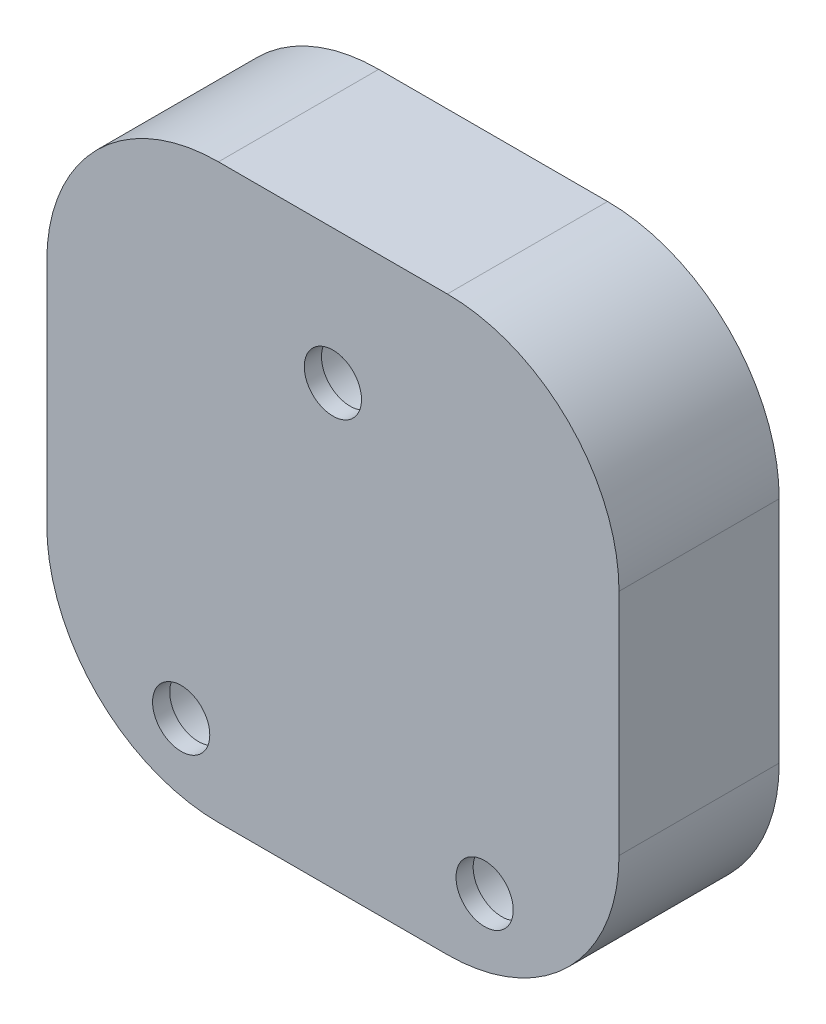
ISO-10303-21;
HEADER;
FILE_DESCRIPTION(('STEP AP214'),'2;1');
FILE_NAME('part.step','',(''),(''),'','','');
FILE_SCHEMA(('AUTOMOTIVE_DESIGN { 1 0 10303 214 1 1 1 1 }'));
ENDSEC;
DATA;
#1=APPLICATION_CONTEXT('core data for automotive mechanical design processes');
#2=APPLICATION_PROTOCOL_DEFINITION('international standard','automotive_design',2000,#1);
#3=PRODUCT_CONTEXT('',#1,'mechanical');
#4=PRODUCT('Part','Part','',(#3));
#5=PRODUCT_RELATED_PRODUCT_CATEGORY('part','',(#4));
#6=PRODUCT_DEFINITION_FORMATION('','',#4);
#7=PRODUCT_DEFINITION_CONTEXT('part definition',#1,'design');
#8=PRODUCT_DEFINITION('design','',#6,#7);
#9=PRODUCT_DEFINITION_SHAPE('','',#8);
#10=(LENGTH_UNIT() NAMED_UNIT(*) SI_UNIT(.MILLI.,.METRE.));
#11=(NAMED_UNIT(*) PLANE_ANGLE_UNIT() SI_UNIT($,.RADIAN.));
#12=(NAMED_UNIT(*) SI_UNIT($,.STERADIAN.) SOLID_ANGLE_UNIT());
#13=UNCERTAINTY_MEASURE_WITH_UNIT(LENGTH_MEASURE(1.E-05),#10,'distance_accuracy_value','');
#14=(GEOMETRIC_REPRESENTATION_CONTEXT(3) GLOBAL_UNCERTAINTY_ASSIGNED_CONTEXT((#13)) GLOBAL_UNIT_ASSIGNED_CONTEXT((#10,
#11,#12)) REPRESENTATION_CONTEXT('',''));
#15=CARTESIAN_POINT('',(0.,0.,0.));
#16=DIRECTION('',(0.,0.,1.));
#17=DIRECTION('',(1.,0.,0.));
#18=AXIS2_PLACEMENT_3D('',#15,#16,#17);
#19=CARTESIAN_POINT('',(-50.,87.5,-25.));
#20=DIRECTION('',(-1.,0.,0.));
#21=DIRECTION('',(0.,0.,1.));
#22=AXIS2_PLACEMENT_3D('',#19,#20,#21);
#23=PLANE('',#22);
#24=DIRECTION('',(0.,-1.,0.));
#25=VECTOR('',#24,1.);
#26=CARTESIAN_POINT('',(-50.,87.5,3.));
#27=LINE('',#26,#25);
#28=CARTESIAN_POINT('',(-50.,57.5,3.));
#29=VERTEX_POINT('',#28);
#30=CARTESIAN_POINT('',(-50.,17.5,3.));
#31=VERTEX_POINT('',#30);
#32=EDGE_CURVE('E262',#29,#31,#27,.T.);
#33=ORIENTED_EDGE('',*,*,#32,.F.);
#34=DIRECTION('',(0.,0.,1.));
#35=VECTOR('',#34,1.);
#36=CARTESIAN_POINT('',(-50.,57.5,-25.));
#37=LINE('',#36,#35);
#38=CARTESIAN_POINT('',(-50.,57.5,-25.));
#39=VERTEX_POINT('',#38);
#40=EDGE_CURVE('E152',#29,#39,#37,.F.);
#41=ORIENTED_EDGE('',*,*,#40,.T.);
#42=DIRECTION('',(0.,-1.,0.));
#43=VECTOR('',#42,1.);
#44=CARTESIAN_POINT('',(-50.,87.5,-25.));
#45=LINE('',#44,#43);
#46=CARTESIAN_POINT('',(-50.,17.5,-25.));
#47=VERTEX_POINT('',#46);
#48=EDGE_CURVE('E291',#39,#47,#45,.T.);
#49=ORIENTED_EDGE('',*,*,#48,.T.);
#50=DIRECTION('',(0.,0.,1.));
#51=VECTOR('',#50,1.);
#52=CARTESIAN_POINT('',(-50.,17.5,-25.));
#53=LINE('',#52,#51);
#54=EDGE_CURVE('E149',#47,#31,#53,.T.);
#55=ORIENTED_EDGE('',*,*,#54,.T.);
#56=EDGE_LOOP('',(#33,#41,#49,#55));
#57=FACE_BOUND('',#56,.T.);
#58=ADVANCED_FACE('F35',(#57),#23,.T.);
#59=CARTESIAN_POINT('',(-50.,87.5,-25.));
#60=DIRECTION('',(0.,1.,0.));
#61=DIRECTION('',(0.,0.,1.));
#62=AXIS2_PLACEMENT_3D('',#59,#60,#61);
#63=PLANE('',#62);
#64=DIRECTION('',(-1.,0.,0.));
#65=VECTOR('',#64,1.);
#66=CARTESIAN_POINT('',(50.,87.5,3.));
#67=LINE('',#66,#65);
#68=CARTESIAN_POINT('',(20.,87.5,3.));
#69=VERTEX_POINT('',#68);
#70=CARTESIAN_POINT('',(-20.,87.5,3.));
#71=VERTEX_POINT('',#70);
#72=EDGE_CURVE('E261',#69,#71,#67,.T.);
#73=ORIENTED_EDGE('',*,*,#72,.F.);
#74=DIRECTION('',(0.,0.,1.));
#75=VECTOR('',#74,1.);
#76=CARTESIAN_POINT('',(20.,87.5,-25.));
#77=LINE('',#76,#75);
#78=CARTESIAN_POINT('',(20.,87.5,-25.));
#79=VERTEX_POINT('',#78);
#80=EDGE_CURVE('E140',#69,#79,#77,.F.);
#81=ORIENTED_EDGE('',*,*,#80,.T.);
#82=DIRECTION('',(-1.,0.,0.));
#83=VECTOR('',#82,1.);
#84=CARTESIAN_POINT('',(-50.,87.5,-25.));
#85=LINE('',#84,#83);
#86=CARTESIAN_POINT('',(-20.,87.5,-25.));
#87=VERTEX_POINT('',#86);
#88=EDGE_CURVE('E125',#79,#87,#85,.T.);
#89=ORIENTED_EDGE('',*,*,#88,.T.);
#90=DIRECTION('',(0.,0.,1.));
#91=VECTOR('',#90,1.);
#92=CARTESIAN_POINT('',(-20.,87.5,-25.));
#93=LINE('',#92,#91);
#94=EDGE_CURVE('E137',#87,#71,#93,.T.);
#95=ORIENTED_EDGE('',*,*,#94,.T.);
#96=EDGE_LOOP('',(#73,#81,#89,#95));
#97=FACE_BOUND('',#96,.T.);
#98=ADVANCED_FACE('F189',(#97),#63,.T.);
#99=CARTESIAN_POINT('',(50.,87.5,-25.));
#100=DIRECTION('',(1.,0.,0.));
#101=DIRECTION('',(0.,1.,0.));
#102=AXIS2_PLACEMENT_3D('',#99,#100,#101);
#103=PLANE('',#102);
#104=DIRECTION('',(0.,1.,0.));
#105=VECTOR('',#104,1.);
#106=CARTESIAN_POINT('',(50.,87.5,-25.));
#107=LINE('',#106,#105);
#108=CARTESIAN_POINT('',(50.,17.5,-25.));
#109=VERTEX_POINT('',#108);
#110=CARTESIAN_POINT('',(50.,57.5,-25.));
#111=VERTEX_POINT('',#110);
#112=EDGE_CURVE('E129',#109,#111,#107,.T.);
#113=ORIENTED_EDGE('',*,*,#112,.T.);
#114=DIRECTION('',(0.,0.,1.));
#115=VECTOR('',#114,1.);
#116=CARTESIAN_POINT('',(50.,57.5,-25.));
#117=LINE('',#116,#115);
#118=CARTESIAN_POINT('',(50.,57.5,3.));
#119=VERTEX_POINT('',#118);
#120=EDGE_CURVE('E121',#111,#119,#117,.T.);
#121=ORIENTED_EDGE('',*,*,#120,.T.);
#122=DIRECTION('',(0.,1.,0.));
#123=VECTOR('',#122,1.);
#124=CARTESIAN_POINT('',(50.,-12.5,3.));
#125=LINE('',#124,#123);
#126=CARTESIAN_POINT('',(50.,17.5,3.));
#127=VERTEX_POINT('',#126);
#128=EDGE_CURVE('E106',#127,#119,#125,.T.);
#129=ORIENTED_EDGE('',*,*,#128,.F.);
#130=DIRECTION('',(0.,0.,1.));
#131=VECTOR('',#130,1.);
#132=CARTESIAN_POINT('',(50.,17.5,-25.));
#133=LINE('',#132,#131);
#134=EDGE_CURVE('E119',#127,#109,#133,.F.);
#135=ORIENTED_EDGE('',*,*,#134,.T.);
#136=EDGE_LOOP('',(#113,#121,#129,#135));
#137=FACE_BOUND('',#136,.T.);
#138=ADVANCED_FACE('F118',(#137),#103,.T.);
#139=CARTESIAN_POINT('',(-50.,-12.5,-25.));
#140=DIRECTION('',(0.,-1.,0.));
#141=DIRECTION('',(1.,0.,0.));
#142=AXIS2_PLACEMENT_3D('',#139,#140,#141);
#143=PLANE('',#142);
#144=DIRECTION('',(1.,0.,0.));
#145=VECTOR('',#144,1.);
#146=CARTESIAN_POINT('',(-50.,-12.5,-25.));
#147=LINE('',#146,#145);
#148=CARTESIAN_POINT('',(-20.,-12.5,-25.));
#149=VERTEX_POINT('',#148);
#150=CARTESIAN_POINT('',(20.,-12.5,-25.));
#151=VERTEX_POINT('',#150);
#152=EDGE_CURVE('E296',#149,#151,#147,.T.);
#153=ORIENTED_EDGE('',*,*,#152,.T.);
#154=DIRECTION('',(0.,0.,1.));
#155=VECTOR('',#154,1.);
#156=CARTESIAN_POINT('',(20.,-12.5,-25.));
#157=LINE('',#156,#155);
#158=CARTESIAN_POINT('',(20.,-12.5,3.));
#159=VERTEX_POINT('',#158);
#160=EDGE_CURVE('E155',#151,#159,#157,.T.);
#161=ORIENTED_EDGE('',*,*,#160,.T.);
#162=DIRECTION('',(1.,0.,0.));
#163=VECTOR('',#162,1.);
#164=CARTESIAN_POINT('',(-50.,-12.5,3.));
#165=LINE('',#164,#163);
#166=CARTESIAN_POINT('',(-20.,-12.5,3.));
#167=VERTEX_POINT('',#166);
#168=EDGE_CURVE('E107',#167,#159,#165,.T.);
#169=ORIENTED_EDGE('',*,*,#168,.F.);
#170=DIRECTION('',(0.,0.,1.));
#171=VECTOR('',#170,1.);
#172=CARTESIAN_POINT('',(-20.,-12.5,-25.));
#173=LINE('',#172,#171);
#174=EDGE_CURVE('E57',#167,#149,#173,.F.);
#175=ORIENTED_EDGE('',*,*,#174,.T.);
#176=EDGE_LOOP('',(#153,#161,#169,#175));
#177=FACE_BOUND('',#176,.T.);
#178=ADVANCED_FACE('F200',(#177),#143,.T.);
#179=CARTESIAN_POINT('',(0.,0.,-25.));
#180=DIRECTION('',(0.,0.,1.));
#181=DIRECTION('',(1.,0.,0.));
#182=AXIS2_PLACEMENT_3D('',#179,#180,#181);
#183=PLANE('',#182);
#184=CARTESIAN_POINT('',(0.,37.5,-25.));
#185=DIRECTION('',(0.,0.,1.));
#186=DIRECTION('',(1.,0.,0.));
#187=AXIS2_PLACEMENT_3D('',#184,#185,#186);
#188=CIRCLE('',#187,10.5);
#189=CARTESIAN_POINT('',(10.5,37.5,-25.));
#190=VERTEX_POINT('',#189);
#191=EDGE_CURVE('E12',#190,#190,#188,.T.);
#192=ORIENTED_EDGE('',*,*,#191,.T.);
#193=EDGE_LOOP('',(#192));
#194=FACE_BOUND('',#193,.T.);
#195=CARTESIAN_POINT('',(26.5165042944955,0.,-25.));
#196=DIRECTION('',(0.,0.,1.));
#197=DIRECTION('',(1.,0.,0.));
#198=AXIS2_PLACEMENT_3D('',#195,#196,#197);
#199=CIRCLE('',#198,11.0999999996577);
#200=CARTESIAN_POINT('',(37.6165042941533,0.,-25.));
#201=VERTEX_POINT('',#200);
#202=EDGE_CURVE('E163',#201,#201,#199,.T.);
#203=ORIENTED_EDGE('',*,*,#202,.T.);
#204=EDGE_LOOP('',(#203));
#205=FACE_BOUND('',#204,.T.);
#206=CARTESIAN_POINT('',(-26.5165042944955,0.,-25.));
#207=DIRECTION('',(0.,0.,1.));
#208=DIRECTION('',(1.,0.,0.));
#209=AXIS2_PLACEMENT_3D('',#206,#207,#208);
#210=CIRCLE('',#209,11.0999999996578);
#211=CARTESIAN_POINT('',(-15.4165042948378,0.,-25.));
#212=VERTEX_POINT('',#211);
#213=EDGE_CURVE('E160',#212,#212,#210,.T.);
#214=ORIENTED_EDGE('',*,*,#213,.T.);
#215=EDGE_LOOP('',(#214));
#216=FACE_BOUND('',#215,.T.);
#217=CARTESIAN_POINT('',(0.,64.0165042944955,-25.));
#218=DIRECTION('',(0.,0.,1.));
#219=DIRECTION('',(1.,0.,0.));
#220=AXIS2_PLACEMENT_3D('',#217,#218,#219);
#221=CIRCLE('',#220,11.0999999996577);
#222=CARTESIAN_POINT('',(11.0999999996578,64.0165042944955,-25.));
#223=VERTEX_POINT('',#222);
#224=EDGE_CURVE('E157',#223,#223,#221,.T.);
#225=ORIENTED_EDGE('',*,*,#224,.T.);
#226=EDGE_LOOP('',(#225));
#227=FACE_BOUND('',#226,.T.);
#228=CARTESIAN_POINT('',(-26.5165042944955,64.0165042944955,-25.));
#229=DIRECTION('',(0.,0.,1.));
#230=DIRECTION('',(1.,0.,0.));
#231=AXIS2_PLACEMENT_3D('',#228,#229,#230);
#232=CIRCLE('',#231,4.025);
#233=CARTESIAN_POINT('',(-22.4915042944955,64.0165042944955,-25.));
#234=VERTEX_POINT('',#233);
#235=EDGE_CURVE('E245',#234,#234,#232,.T.);
#236=ORIENTED_EDGE('',*,*,#235,.T.);
#237=EDGE_LOOP('',(#236));
#238=FACE_BOUND('',#237,.T.);
#239=CARTESIAN_POINT('',(26.5165042944955,64.0165042944955,-25.));
#240=DIRECTION('',(0.,0.,1.));
#241=DIRECTION('',(1.,0.,0.));
#242=AXIS2_PLACEMENT_3D('',#239,#240,#241);
#243=CIRCLE('',#242,4.025);
#244=CARTESIAN_POINT('',(30.5415042944955,64.0165042944955,-25.));
#245=VERTEX_POINT('',#244);
#246=EDGE_CURVE('E249',#245,#245,#243,.T.);
#247=ORIENTED_EDGE('',*,*,#246,.T.);
#248=EDGE_LOOP('',(#247));
#249=FACE_BOUND('',#248,.T.);
#250=CARTESIAN_POINT('',(0.,0.,-25.));
#251=DIRECTION('',(0.,0.,1.));
#252=DIRECTION('',(1.,0.,0.));
#253=AXIS2_PLACEMENT_3D('',#250,#251,#252);
#254=CIRCLE('',#253,4.025);
#255=CARTESIAN_POINT('',(4.025,0.,-25.));
#256=VERTEX_POINT('',#255);
#257=EDGE_CURVE('E252',#256,#256,#254,.T.);
#258=ORIENTED_EDGE('',*,*,#257,.T.);
#259=EDGE_LOOP('',(#258));
#260=FACE_BOUND('',#259,.T.);
#261=ORIENTED_EDGE('',*,*,#88,.F.);
#262=CARTESIAN_POINT('',(20.,57.5,-25.));
#263=DIRECTION('',(0.,0.,1.));
#264=DIRECTION('',(1.,0.,0.));
#265=AXIS2_PLACEMENT_3D('',#262,#263,#264);
#266=CIRCLE('',#265,30.);
#267=EDGE_CURVE('E147',#79,#111,#266,.F.);
#268=ORIENTED_EDGE('',*,*,#267,.T.);
#269=ORIENTED_EDGE('',*,*,#112,.F.);
#270=CARTESIAN_POINT('',(20.,17.5,-25.));
#271=DIRECTION('',(0.,0.,1.));
#272=DIRECTION('',(1.,0.,0.));
#273=AXIS2_PLACEMENT_3D('',#270,#271,#272);
#274=CIRCLE('',#273,30.);
#275=EDGE_CURVE('E50',#109,#151,#274,.F.);
#276=ORIENTED_EDGE('',*,*,#275,.T.);
#277=ORIENTED_EDGE('',*,*,#152,.F.);
#278=CARTESIAN_POINT('',(-20.,17.5,-25.));
#279=DIRECTION('',(0.,0.,1.));
#280=DIRECTION('',(1.,0.,0.));
#281=AXIS2_PLACEMENT_3D('',#278,#279,#280);
#282=CIRCLE('',#281,30.);
#283=EDGE_CURVE('E142',#149,#47,#282,.F.);
#284=ORIENTED_EDGE('',*,*,#283,.T.);
#285=ORIENTED_EDGE('',*,*,#48,.F.);
#286=CARTESIAN_POINT('',(-20.,57.5,-25.));
#287=DIRECTION('',(0.,0.,1.));
#288=DIRECTION('',(1.,0.,0.));
#289=AXIS2_PLACEMENT_3D('',#286,#287,#288);
#290=CIRCLE('',#289,30.);
#291=EDGE_CURVE('E145',#39,#87,#290,.F.);
#292=ORIENTED_EDGE('',*,*,#291,.T.);
#293=EDGE_LOOP('',(#261,#268,#269,#276,#277,#284,#285,#292));
#294=FACE_BOUND('',#293,.T.);
#295=ADVANCED_FACE('F236',(#194,#205,#216,#227,#238,#249,#260,#294),#183,.F.);
#296=CARTESIAN_POINT('',(0.,0.,-25.));
#297=DIRECTION('',(0.,0.,1.));
#298=DIRECTION('',(1.,0.,0.));
#299=AXIS2_PLACEMENT_3D('',#296,#297,#298);
#300=CYLINDRICAL_SURFACE('',#299,4.025);
#301=ORIENTED_EDGE('',*,*,#257,.F.);
#302=EDGE_LOOP('',(#301));
#303=FACE_BOUND('',#302,.T.);
#304=CARTESIAN_POINT('',(0.,0.,0.));
#305=DIRECTION('',(0.,0.,1.));
#306=DIRECTION('',(1.,0.,0.));
#307=AXIS2_PLACEMENT_3D('',#304,#305,#306);
#308=CIRCLE('',#307,4.025);
#309=CARTESIAN_POINT('',(4.025,0.,0.));
#310=VERTEX_POINT('',#309);
#311=EDGE_CURVE('E122',#310,#310,#308,.T.);
#312=ORIENTED_EDGE('',*,*,#311,.T.);
#313=EDGE_LOOP('',(#312));
#314=FACE_BOUND('',#313,.T.);
#315=ADVANCED_FACE('F239',(#303,#314),#300,.F.);
#316=CARTESIAN_POINT('',(26.5165042944955,64.0165042944955,-25.));
#317=DIRECTION('',(0.,0.,1.));
#318=DIRECTION('',(1.,0.,0.));
#319=AXIS2_PLACEMENT_3D('',#316,#317,#318);
#320=CYLINDRICAL_SURFACE('',#319,4.025);
#321=ORIENTED_EDGE('',*,*,#246,.F.);
#322=EDGE_LOOP('',(#321));
#323=FACE_BOUND('',#322,.T.);
#324=CARTESIAN_POINT('',(26.5165042944955,64.0165042944955,0.));
#325=DIRECTION('',(0.,0.,1.));
#326=DIRECTION('',(1.,0.,0.));
#327=AXIS2_PLACEMENT_3D('',#324,#325,#326);
#328=CIRCLE('',#327,4.025);
#329=CARTESIAN_POINT('',(30.5415042944955,64.0165042944955,0.));
#330=VERTEX_POINT('',#329);
#331=EDGE_CURVE('E286',#330,#330,#328,.T.);
#332=ORIENTED_EDGE('',*,*,#331,.T.);
#333=EDGE_LOOP('',(#332));
#334=FACE_BOUND('',#333,.T.);
#335=ADVANCED_FACE('F309',(#323,#334),#320,.F.);
#336=CARTESIAN_POINT('',(-26.5165042944955,64.0165042944955,-25.));
#337=DIRECTION('',(0.,0.,1.));
#338=DIRECTION('',(1.,0.,0.));
#339=AXIS2_PLACEMENT_3D('',#336,#337,#338);
#340=CYLINDRICAL_SURFACE('',#339,4.025);
#341=ORIENTED_EDGE('',*,*,#235,.F.);
#342=EDGE_LOOP('',(#341));
#343=FACE_BOUND('',#342,.T.);
#344=CARTESIAN_POINT('',(-26.5165042944955,64.0165042944955,0.));
#345=DIRECTION('',(0.,0.,1.));
#346=DIRECTION('',(1.,0.,0.));
#347=AXIS2_PLACEMENT_3D('',#344,#345,#346);
#348=CIRCLE('',#347,4.025);
#349=CARTESIAN_POINT('',(-22.4915042944955,64.0165042944955,0.));
#350=VERTEX_POINT('',#349);
#351=EDGE_CURVE('E282',#350,#350,#348,.T.);
#352=ORIENTED_EDGE('',*,*,#351,.T.);
#353=EDGE_LOOP('',(#352));
#354=FACE_BOUND('',#353,.T.);
#355=ADVANCED_FACE('F313',(#343,#354),#340,.F.);
#356=CARTESIAN_POINT('',(0.,64.0165042944955,-25.));
#357=DIRECTION('',(0.,0.,1.));
#358=DIRECTION('',(1.,0.,0.));
#359=AXIS2_PLACEMENT_3D('',#356,#357,#358);
#360=CYLINDRICAL_SURFACE('',#359,8.09999999965775);
#361=CARTESIAN_POINT('',(0.,64.0165042944955,-22.));
#362=DIRECTION('',(0.,0.,1.));
#363=DIRECTION('',(1.,0.,0.));
#364=AXIS2_PLACEMENT_3D('',#361,#362,#363);
#365=CIRCLE('',#364,8.09999999965775);
#366=CARTESIAN_POINT('',(8.09999999965777,64.0165042944955,-22.));
#367=VERTEX_POINT('',#366);
#368=EDGE_CURVE('E172',#367,#367,#365,.F.);
#369=ORIENTED_EDGE('',*,*,#368,.T.);
#370=EDGE_LOOP('',(#369));
#371=FACE_BOUND('',#370,.T.);
#372=CARTESIAN_POINT('',(0.,64.0165042944955,0.));
#373=DIRECTION('',(0.,0.,1.));
#374=DIRECTION('',(1.,0.,0.));
#375=AXIS2_PLACEMENT_3D('',#372,#373,#374);
#376=CIRCLE('',#375,8.09999999965775);
#377=CARTESIAN_POINT('',(8.09999999965777,64.0165042944955,0.));
#378=VERTEX_POINT('',#377);
#379=EDGE_CURVE('E279',#378,#378,#376,.T.);
#380=ORIENTED_EDGE('',*,*,#379,.T.);
#381=EDGE_LOOP('',(#380));
#382=FACE_BOUND('',#381,.T.);
#383=ADVANCED_FACE('F317',(#371,#382),#360,.F.);
#384=CARTESIAN_POINT('',(-26.5165042944955,0.,-25.));
#385=DIRECTION('',(0.,0.,1.));
#386=DIRECTION('',(1.,0.,0.));
#387=AXIS2_PLACEMENT_3D('',#384,#385,#386);
#388=CYLINDRICAL_SURFACE('',#387,8.09999999965776);
#389=CARTESIAN_POINT('',(-26.5165042944955,0.,-22.));
#390=DIRECTION('',(0.,0.,1.));
#391=DIRECTION('',(1.,0.,0.));
#392=AXIS2_PLACEMENT_3D('',#389,#390,#391);
#393=CIRCLE('',#392,8.09999999965776);
#394=CARTESIAN_POINT('',(-18.4165042948378,0.,-22.));
#395=VERTEX_POINT('',#394);
#396=EDGE_CURVE('E169',#395,#395,#393,.F.);
#397=ORIENTED_EDGE('',*,*,#396,.T.);
#398=EDGE_LOOP('',(#397));
#399=FACE_BOUND('',#398,.T.);
#400=CARTESIAN_POINT('',(-26.5165042944955,0.,0.));
#401=DIRECTION('',(0.,0.,1.));
#402=DIRECTION('',(1.,0.,0.));
#403=AXIS2_PLACEMENT_3D('',#400,#401,#402);
#404=CIRCLE('',#403,8.09999999965776);
#405=CARTESIAN_POINT('',(-18.4165042948378,0.,0.));
#406=VERTEX_POINT('',#405);
#407=EDGE_CURVE('E276',#406,#406,#404,.T.);
#408=ORIENTED_EDGE('',*,*,#407,.T.);
#409=EDGE_LOOP('',(#408));
#410=FACE_BOUND('',#409,.T.);
#411=ADVANCED_FACE('F321',(#399,#410),#388,.F.);
#412=CARTESIAN_POINT('',(26.5165042944955,0.,-25.));
#413=DIRECTION('',(0.,0.,1.));
#414=DIRECTION('',(1.,0.,0.));
#415=AXIS2_PLACEMENT_3D('',#412,#413,#414);
#416=CYLINDRICAL_SURFACE('',#415,8.09999999965775);
#417=CARTESIAN_POINT('',(26.5165042944955,0.,-22.));
#418=DIRECTION('',(0.,0.,1.));
#419=DIRECTION('',(1.,0.,0.));
#420=AXIS2_PLACEMENT_3D('',#417,#418,#419);
#421=CIRCLE('',#420,8.09999999965775);
#422=CARTESIAN_POINT('',(34.6165042941533,0.,-22.));
#423=VERTEX_POINT('',#422);
#424=EDGE_CURVE('E166',#423,#423,#421,.F.);
#425=ORIENTED_EDGE('',*,*,#424,.T.);
#426=EDGE_LOOP('',(#425));
#427=FACE_BOUND('',#426,.T.);
#428=CARTESIAN_POINT('',(26.5165042944955,0.,0.));
#429=DIRECTION('',(0.,0.,1.));
#430=DIRECTION('',(1.,0.,0.));
#431=AXIS2_PLACEMENT_3D('',#428,#429,#430);
#432=CIRCLE('',#431,8.09999999965775);
#433=CARTESIAN_POINT('',(34.6165042941533,0.,0.));
#434=VERTEX_POINT('',#433);
#435=EDGE_CURVE('E273',#434,#434,#432,.T.);
#436=ORIENTED_EDGE('',*,*,#435,.T.);
#437=EDGE_LOOP('',(#436));
#438=FACE_BOUND('',#437,.T.);
#439=ADVANCED_FACE('F325',(#427,#438),#416,.F.);
#440=CARTESIAN_POINT('',(0.,0.,0.));
#441=DIRECTION('',(0.,0.,1.));
#442=DIRECTION('',(1.,0.,0.));
#443=AXIS2_PLACEMENT_3D('',#440,#441,#442);
#444=PLANE('',#443);
#445=ORIENTED_EDGE('',*,*,#311,.F.);
#446=EDGE_LOOP('',(#445));
#447=FACE_BOUND('',#446,.T.);
#448=ADVANCED_FACE('F329',(#447),#444,.F.);
#449=ORIENTED_EDGE('',*,*,#331,.F.);
#450=EDGE_LOOP('',(#449));
#451=FACE_BOUND('',#450,.T.);
#452=ADVANCED_FACE('F390',(#451),#444,.F.);
#453=ORIENTED_EDGE('',*,*,#351,.F.);
#454=EDGE_LOOP('',(#453));
#455=FACE_BOUND('',#454,.T.);
#456=ADVANCED_FACE('F335',(#455),#444,.F.);
#457=CARTESIAN_POINT('',(26.5165042944955,0.,0.));
#458=DIRECTION('',(0.,0.,1.));
#459=DIRECTION('',(1.,0.,0.));
#460=AXIS2_PLACEMENT_3D('',#457,#458,#459);
#461=CIRCLE('',#460,4.99999999965774);
#462=CARTESIAN_POINT('',(31.5165042941533,0.,0.));
#463=VERTEX_POINT('',#462);
#464=EDGE_CURVE('E363',#463,#463,#461,.T.);
#465=ORIENTED_EDGE('',*,*,#464,.T.);
#466=EDGE_LOOP('',(#465));
#467=FACE_BOUND('',#466,.T.);
#468=ORIENTED_EDGE('',*,*,#435,.F.);
#469=EDGE_LOOP('',(#468));
#470=FACE_BOUND('',#469,.T.);
#471=ADVANCED_FACE('F331',(#467,#470),#444,.F.);
#472=CARTESIAN_POINT('',(-26.5165042944955,0.,0.));
#473=DIRECTION('',(0.,0.,1.));
#474=DIRECTION('',(1.,0.,0.));
#475=AXIS2_PLACEMENT_3D('',#472,#473,#474);
#476=CIRCLE('',#475,4.99999999965775);
#477=CARTESIAN_POINT('',(-21.5165042948378,0.,0.));
#478=VERTEX_POINT('',#477);
#479=EDGE_CURVE('E359',#478,#478,#476,.T.);
#480=ORIENTED_EDGE('',*,*,#479,.T.);
#481=EDGE_LOOP('',(#480));
#482=FACE_BOUND('',#481,.T.);
#483=ORIENTED_EDGE('',*,*,#407,.F.);
#484=EDGE_LOOP('',(#483));
#485=FACE_BOUND('',#484,.T.);
#486=ADVANCED_FACE('F334',(#482,#485),#444,.F.);
#487=CARTESIAN_POINT('',(0.,64.0165042944955,0.));
#488=DIRECTION('',(0.,0.,1.));
#489=DIRECTION('',(1.,0.,0.));
#490=AXIS2_PLACEMENT_3D('',#487,#488,#489);
#491=CIRCLE('',#490,4.99999999965775);
#492=CARTESIAN_POINT('',(4.99999999965778,64.0165042944955,0.));
#493=VERTEX_POINT('',#492);
#494=EDGE_CURVE('E268',#493,#493,#491,.T.);
#495=ORIENTED_EDGE('',*,*,#494,.T.);
#496=EDGE_LOOP('',(#495));
#497=FACE_BOUND('',#496,.T.);
#498=ORIENTED_EDGE('',*,*,#379,.F.);
#499=EDGE_LOOP('',(#498));
#500=FACE_BOUND('',#499,.T.);
#501=ADVANCED_FACE('F340',(#497,#500),#444,.F.);
#502=CARTESIAN_POINT('',(0.,0.,3.));
#503=DIRECTION('',(0.,0.,1.));
#504=DIRECTION('',(1.,0.,0.));
#505=AXIS2_PLACEMENT_3D('',#502,#503,#504);
#506=PLANE('',#505);
#507=CARTESIAN_POINT('',(26.5165042944955,0.,3.));
#508=DIRECTION('',(0.,0.,1.));
#509=DIRECTION('',(1.,0.,0.));
#510=AXIS2_PLACEMENT_3D('',#507,#508,#509);
#511=CIRCLE('',#510,4.99999999965774);
#512=CARTESIAN_POINT('',(31.5165042941533,0.,3.));
#513=VERTEX_POINT('',#512);
#514=EDGE_CURVE('E368',#513,#513,#511,.T.);
#515=ORIENTED_EDGE('',*,*,#514,.F.);
#516=EDGE_LOOP('',(#515));
#517=FACE_BOUND('',#516,.T.);
#518=ORIENTED_EDGE('',*,*,#128,.T.);
#519=CARTESIAN_POINT('',(20.,57.5,3.));
#520=DIRECTION('',(0.,0.,1.));
#521=DIRECTION('',(1.,0.,0.));
#522=AXIS2_PLACEMENT_3D('',#519,#520,#521);
#523=CIRCLE('',#522,30.);
#524=EDGE_CURVE('E135',#119,#69,#523,.T.);
#525=ORIENTED_EDGE('',*,*,#524,.T.);
#526=ORIENTED_EDGE('',*,*,#72,.T.);
#527=CARTESIAN_POINT('',(-20.,57.5,3.));
#528=DIRECTION('',(0.,0.,1.));
#529=DIRECTION('',(1.,0.,0.));
#530=AXIS2_PLACEMENT_3D('',#527,#528,#529);
#531=CIRCLE('',#530,30.);
#532=EDGE_CURVE('E112',#71,#29,#531,.T.);
#533=ORIENTED_EDGE('',*,*,#532,.T.);
#534=ORIENTED_EDGE('',*,*,#32,.T.);
#535=CARTESIAN_POINT('',(-20.,17.5,3.));
#536=DIRECTION('',(0.,0.,1.));
#537=DIRECTION('',(1.,0.,0.));
#538=AXIS2_PLACEMENT_3D('',#535,#536,#537);
#539=CIRCLE('',#538,30.);
#540=EDGE_CURVE('E113',#31,#167,#539,.T.);
#541=ORIENTED_EDGE('',*,*,#540,.T.);
#542=ORIENTED_EDGE('',*,*,#168,.T.);
#543=CARTESIAN_POINT('',(20.,17.5,3.));
#544=DIRECTION('',(0.,0.,1.));
#545=DIRECTION('',(1.,0.,0.));
#546=AXIS2_PLACEMENT_3D('',#543,#544,#545);
#547=CIRCLE('',#546,30.);
#548=EDGE_CURVE('E102',#159,#127,#547,.T.);
#549=ORIENTED_EDGE('',*,*,#548,.T.);
#550=EDGE_LOOP('',(#518,#525,#526,#533,#534,#541,#542,#549));
#551=FACE_BOUND('',#550,.T.);
#552=CARTESIAN_POINT('',(0.,64.0165042944955,3.));
#553=DIRECTION('',(0.,0.,1.));
#554=DIRECTION('',(1.,0.,0.));
#555=AXIS2_PLACEMENT_3D('',#552,#553,#554);
#556=CIRCLE('',#555,4.99999999965775);
#557=CARTESIAN_POINT('',(4.99999999965778,64.0165042944955,3.));
#558=VERTEX_POINT('',#557);
#559=EDGE_CURVE('E263',#558,#558,#556,.T.);
#560=ORIENTED_EDGE('',*,*,#559,.F.);
#561=EDGE_LOOP('',(#560));
#562=FACE_BOUND('',#561,.T.);
#563=CARTESIAN_POINT('',(-26.5165042944955,0.,3.));
#564=DIRECTION('',(0.,0.,1.));
#565=DIRECTION('',(1.,0.,0.));
#566=AXIS2_PLACEMENT_3D('',#563,#564,#565);
#567=CIRCLE('',#566,4.99999999965775);
#568=CARTESIAN_POINT('',(-21.5165042948378,0.,3.));
#569=VERTEX_POINT('',#568);
#570=EDGE_CURVE('E356',#569,#569,#567,.T.);
#571=ORIENTED_EDGE('',*,*,#570,.F.);
#572=EDGE_LOOP('',(#571));
#573=FACE_BOUND('',#572,.T.);
#574=ADVANCED_FACE('F104',(#517,#551,#562,#573),#506,.T.);
#575=CARTESIAN_POINT('',(0.,64.0165042944955,3.));
#576=DIRECTION('',(0.,0.,-1.));
#577=DIRECTION('',(-1.,0.,0.));
#578=AXIS2_PLACEMENT_3D('',#575,#576,#577);
#579=CYLINDRICAL_SURFACE('',#578,4.99999999965775);
#580=ORIENTED_EDGE('',*,*,#559,.T.);
#581=EDGE_LOOP('',(#580));
#582=FACE_BOUND('',#581,.T.);
#583=ORIENTED_EDGE('',*,*,#494,.F.);
#584=EDGE_LOOP('',(#583));
#585=FACE_BOUND('',#584,.T.);
#586=ADVANCED_FACE('F339',(#582,#585),#579,.F.);
#587=CARTESIAN_POINT('',(26.5165042944955,0.,3.));
#588=DIRECTION('',(0.,0.,-1.));
#589=DIRECTION('',(-1.,0.,0.));
#590=AXIS2_PLACEMENT_3D('',#587,#588,#589);
#591=CYLINDRICAL_SURFACE('',#590,4.99999999965774);
#592=ORIENTED_EDGE('',*,*,#514,.T.);
#593=EDGE_LOOP('',(#592));
#594=FACE_BOUND('',#593,.T.);
#595=ORIENTED_EDGE('',*,*,#464,.F.);
#596=EDGE_LOOP('',(#595));
#597=FACE_BOUND('',#596,.T.);
#598=ADVANCED_FACE('F344',(#594,#597),#591,.F.);
#599=CARTESIAN_POINT('',(-26.5165042944955,0.,3.));
#600=DIRECTION('',(0.,0.,-1.));
#601=DIRECTION('',(-1.,0.,0.));
#602=AXIS2_PLACEMENT_3D('',#599,#600,#601);
#603=CYLINDRICAL_SURFACE('',#602,4.99999999965775);
#604=ORIENTED_EDGE('',*,*,#570,.T.);
#605=EDGE_LOOP('',(#604));
#606=FACE_BOUND('',#605,.T.);
#607=ORIENTED_EDGE('',*,*,#479,.F.);
#608=EDGE_LOOP('',(#607));
#609=FACE_BOUND('',#608,.T.);
#610=ADVANCED_FACE('F206',(#606,#609),#603,.F.);
#611=CARTESIAN_POINT('',(20.,57.5,-25.));
#612=DIRECTION('',(0.,0.,1.));
#613=DIRECTION('',(1.,0.,0.));
#614=AXIS2_PLACEMENT_3D('',#611,#612,#613);
#615=CYLINDRICAL_SURFACE('',#614,30.);
#616=ORIENTED_EDGE('',*,*,#267,.F.);
#617=ORIENTED_EDGE('',*,*,#80,.F.);
#618=ORIENTED_EDGE('',*,*,#524,.F.);
#619=ORIENTED_EDGE('',*,*,#120,.F.);
#620=EDGE_LOOP('',(#616,#617,#618,#619));
#621=FACE_BOUND('',#620,.T.);
#622=ADVANCED_FACE('F202',(#621),#615,.T.);
#623=CARTESIAN_POINT('',(-20.,57.5,-25.));
#624=DIRECTION('',(0.,0.,1.));
#625=DIRECTION('',(1.,0.,0.));
#626=AXIS2_PLACEMENT_3D('',#623,#624,#625);
#627=CYLINDRICAL_SURFACE('',#626,30.);
#628=ORIENTED_EDGE('',*,*,#291,.F.);
#629=ORIENTED_EDGE('',*,*,#40,.F.);
#630=ORIENTED_EDGE('',*,*,#532,.F.);
#631=ORIENTED_EDGE('',*,*,#94,.F.);
#632=EDGE_LOOP('',(#628,#629,#630,#631));
#633=FACE_BOUND('',#632,.T.);
#634=ADVANCED_FACE('F205',(#633),#627,.T.);
#635=CARTESIAN_POINT('',(20.,17.5,-25.));
#636=DIRECTION('',(0.,0.,1.));
#637=DIRECTION('',(1.,0.,0.));
#638=AXIS2_PLACEMENT_3D('',#635,#636,#637);
#639=CYLINDRICAL_SURFACE('',#638,30.);
#640=ORIENTED_EDGE('',*,*,#275,.F.);
#641=ORIENTED_EDGE('',*,*,#134,.F.);
#642=ORIENTED_EDGE('',*,*,#548,.F.);
#643=ORIENTED_EDGE('',*,*,#160,.F.);
#644=EDGE_LOOP('',(#640,#641,#642,#643));
#645=FACE_BOUND('',#644,.T.);
#646=ADVANCED_FACE('F124',(#645),#639,.T.);
#647=CARTESIAN_POINT('',(-20.,17.5,-25.));
#648=DIRECTION('',(0.,0.,1.));
#649=DIRECTION('',(1.,0.,0.));
#650=AXIS2_PLACEMENT_3D('',#647,#648,#649);
#651=CYLINDRICAL_SURFACE('',#650,30.);
#652=ORIENTED_EDGE('',*,*,#283,.F.);
#653=ORIENTED_EDGE('',*,*,#174,.F.);
#654=ORIENTED_EDGE('',*,*,#540,.F.);
#655=ORIENTED_EDGE('',*,*,#54,.F.);
#656=EDGE_LOOP('',(#652,#653,#654,#655));
#657=FACE_BOUND('',#656,.T.);
#658=ADVANCED_FACE('F213',(#657),#651,.T.);
#659=CARTESIAN_POINT('',(26.5165042944955,0.,-22.));
#660=DIRECTION('',(0.,0.,1.));
#661=DIRECTION('',(1.,0.,0.));
#662=AXIS2_PLACEMENT_3D('',#659,#660,#661);
#663=TOROIDAL_SURFACE('',#662,11.0999999996577,3.);
#664=ORIENTED_EDGE('',*,*,#424,.F.);
#665=EDGE_LOOP('',(#664));
#666=FACE_BOUND('',#665,.T.);
#667=ORIENTED_EDGE('',*,*,#202,.F.);
#668=EDGE_LOOP('',(#667));
#669=FACE_BOUND('',#668,.T.);
#670=ADVANCED_FACE('F216',(#666,#669),#663,.T.);
#671=CARTESIAN_POINT('',(-26.5165042944955,0.,-22.));
#672=DIRECTION('',(0.,0.,1.));
#673=DIRECTION('',(1.,0.,0.));
#674=AXIS2_PLACEMENT_3D('',#671,#672,#673);
#675=TOROIDAL_SURFACE('',#674,11.0999999996578,3.);
#676=ORIENTED_EDGE('',*,*,#396,.F.);
#677=EDGE_LOOP('',(#676));
#678=FACE_BOUND('',#677,.T.);
#679=ORIENTED_EDGE('',*,*,#213,.F.);
#680=EDGE_LOOP('',(#679));
#681=FACE_BOUND('',#680,.T.);
#682=ADVANCED_FACE('F220',(#678,#681),#675,.T.);
#683=CARTESIAN_POINT('',(0.,64.0165042944955,-22.));
#684=DIRECTION('',(0.,0.,1.));
#685=DIRECTION('',(1.,0.,0.));
#686=AXIS2_PLACEMENT_3D('',#683,#684,#685);
#687=TOROIDAL_SURFACE('',#686,11.0999999996577,3.);
#688=ORIENTED_EDGE('',*,*,#368,.F.);
#689=EDGE_LOOP('',(#688));
#690=FACE_BOUND('',#689,.T.);
#691=ORIENTED_EDGE('',*,*,#224,.F.);
#692=EDGE_LOOP('',(#691));
#693=FACE_BOUND('',#692,.T.);
#694=ADVANCED_FACE('F223',(#690,#693),#687,.T.);
#695=CARTESIAN_POINT('',(0.,0.,0.));
#696=DIRECTION('',(0.,0.,1.));
#697=DIRECTION('',(1.,0.,0.));
#698=AXIS2_PLACEMENT_3D('',#695,#696,#697);
#699=PLANE('',#698);
#700=CARTESIAN_POINT('',(0.,37.5,0.));
#701=DIRECTION('',(0.,0.,1.));
#702=DIRECTION('',(1.,0.,0.));
#703=AXIS2_PLACEMENT_3D('',#700,#701,#702);
#704=CIRCLE('',#703,7.5);
#705=CARTESIAN_POINT('',(-7.5,37.5,0.));
#706=VERTEX_POINT('',#705);
#707=EDGE_CURVE('E361',#706,#706,#704,.F.);
#708=ORIENTED_EDGE('',*,*,#707,.T.);
#709=EDGE_LOOP('',(#708));
#710=FACE_BOUND('',#709,.T.);
#711=ADVANCED_FACE('F185',(#710),#699,.F.);
#712=CARTESIAN_POINT('',(0.,37.5,24.2132034355964));
#713=DIRECTION('',(0.,0.,-1.));
#714=DIRECTION('',(-1.,0.,0.));
#715=AXIS2_PLACEMENT_3D('',#712,#713,#714);
#716=CYLINDRICAL_SURFACE('',#715,7.5);
#717=CARTESIAN_POINT('',(0.,37.5,-22.));
#718=DIRECTION('',(0.,0.,1.));
#719=DIRECTION('',(1.,0.,0.));
#720=AXIS2_PLACEMENT_3D('',#717,#718,#719);
#721=CIRCLE('',#720,7.5);
#722=CARTESIAN_POINT('',(-7.5,37.5,-22.));
#723=VERTEX_POINT('',#722);
#724=EDGE_CURVE('E43',#723,#723,#721,.F.);
#725=CARTESIAN_POINT('',(-7.5,37.5,-22.));
#726=CARTESIAN_POINT('',(-7.5,37.5,-21.7708333333333));
#727=CARTESIAN_POINT('',(-7.5,37.5,-21.5416666666667));
#728=CARTESIAN_POINT('',(-7.5,37.5,-21.0833333333333));
#729=CARTESIAN_POINT('',(-7.5,37.5,-20.8541666666667));
#730=CARTESIAN_POINT('',(-7.5,37.5,-20.3958333333333));
#731=CARTESIAN_POINT('',(-7.5,37.5,-20.1666666666667));
#732=CARTESIAN_POINT('',(-7.5,37.5,-19.7083333333333));
#733=CARTESIAN_POINT('',(-7.5,37.5,-19.4791666666667));
#734=CARTESIAN_POINT('',(-7.5,37.5,-19.0208333333333));
#735=CARTESIAN_POINT('',(-7.5,37.5,-18.7916666666667));
#736=CARTESIAN_POINT('',(-7.5,37.5,-18.3333333333333));
#737=CARTESIAN_POINT('',(-7.5,37.5,-18.1041666666667));
#738=CARTESIAN_POINT('',(-7.5,37.5,-17.6458333333333));
#739=CARTESIAN_POINT('',(-7.5,37.5,-17.4166666666667));
#740=CARTESIAN_POINT('',(-7.5,37.5,-16.9583333333333));
#741=CARTESIAN_POINT('',(-7.5,37.5,-16.7291666666667));
#742=CARTESIAN_POINT('',(-7.5,37.5,-16.2708333333333));
#743=CARTESIAN_POINT('',(-7.5,37.5,-16.0416666666667));
#744=CARTESIAN_POINT('',(-7.5,37.5,-15.5833333333333));
#745=CARTESIAN_POINT('',(-7.5,37.5,-15.3541666666667));
#746=CARTESIAN_POINT('',(-7.5,37.5,-14.8958333333333));
#747=CARTESIAN_POINT('',(-7.5,37.5,-14.6666666666667));
#748=CARTESIAN_POINT('',(-7.5,37.5,-14.2083333333333));
#749=CARTESIAN_POINT('',(-7.5,37.5,-13.9791666666667));
#750=CARTESIAN_POINT('',(-7.5,37.5,-13.5208333333333));
#751=CARTESIAN_POINT('',(-7.5,37.5,-13.2916666666667));
#752=CARTESIAN_POINT('',(-7.5,37.5,-12.8333333333333));
#753=CARTESIAN_POINT('',(-7.5,37.5,-12.6041666666667));
#754=CARTESIAN_POINT('',(-7.5,37.5,-12.1458333333333));
#755=CARTESIAN_POINT('',(-7.5,37.5,-11.9166666666667));
#756=CARTESIAN_POINT('',(-7.5,37.5,-11.4583333333333));
#757=CARTESIAN_POINT('',(-7.5,37.5,-11.2291666666667));
#758=CARTESIAN_POINT('',(-7.5,37.5,-10.7708333333333));
#759=CARTESIAN_POINT('',(-7.5,37.5,-10.5416666666667));
#760=CARTESIAN_POINT('',(-7.5,37.5,-10.0833333333333));
#761=CARTESIAN_POINT('',(-7.5,37.5,-9.85416666666667));
#762=CARTESIAN_POINT('',(-7.5,37.5,-9.39583333333333));
#763=CARTESIAN_POINT('',(-7.5,37.5,-9.16666666666667));
#764=CARTESIAN_POINT('',(-7.5,37.5,-8.70833333333333));
#765=CARTESIAN_POINT('',(-7.5,37.5,-8.47916666666667));
#766=CARTESIAN_POINT('',(-7.5,37.5,-8.02083333333333));
#767=CARTESIAN_POINT('',(-7.5,37.5,-7.79166666666667));
#768=CARTESIAN_POINT('',(-7.5,37.5,-7.33333333333333));
#769=CARTESIAN_POINT('',(-7.5,37.5,-7.10416666666667));
#770=CARTESIAN_POINT('',(-7.5,37.5,-6.64583333333334));
#771=CARTESIAN_POINT('',(-7.5,37.5,-6.41666666666667));
#772=CARTESIAN_POINT('',(-7.5,37.5,-5.95833333333334));
#773=CARTESIAN_POINT('',(-7.5,37.5,-5.72916666666667));
#774=CARTESIAN_POINT('',(-7.5,37.5,-5.27083333333334));
#775=CARTESIAN_POINT('',(-7.5,37.5,-5.04166666666667));
#776=CARTESIAN_POINT('',(-7.5,37.5,-4.58333333333334));
#777=CARTESIAN_POINT('',(-7.5,37.5,-4.35416666666667));
#778=CARTESIAN_POINT('',(-7.5,37.5,-3.89583333333334));
#779=CARTESIAN_POINT('',(-7.5,37.5,-3.66666666666667));
#780=CARTESIAN_POINT('',(-7.5,37.5,-3.20833333333334));
#781=CARTESIAN_POINT('',(-7.5,37.5,-2.97916666666667));
#782=CARTESIAN_POINT('',(-7.5,37.5,-2.52083333333334));
#783=CARTESIAN_POINT('',(-7.5,37.5,-2.29166666666667));
#784=CARTESIAN_POINT('',(-7.5,37.5,-1.83333333333334));
#785=CARTESIAN_POINT('',(-7.5,37.5,-1.60416666666667));
#786=CARTESIAN_POINT('',(-7.5,37.5,-1.14583333333334));
#787=CARTESIAN_POINT('',(-7.5,37.5,-0.916666666666671));
#788=CARTESIAN_POINT('',(-7.5,37.5,-0.458333333333337));
#789=CARTESIAN_POINT('',(-7.5,37.5,-0.229166666666671));
#790=CARTESIAN_POINT('',(-7.5,37.5,0.));
#791=B_SPLINE_CURVE_WITH_KNOTS('',3,(#725,#726,#727,#728,#729,#730,#731,#732,#733,#734,#735,
#736,#737,#738,#739,#740,#741,#742,#743,#744,#745,#746,#747,#748,#749,#750,#751,#752,#753,#754,
#755,#756,#757,#758,#759,#760,#761,#762,#763,#764,#765,#766,#767,#768,#769,#770,#771,#772,#773,
#774,#775,#776,#777,#778,#779,#780,#781,#782,#783,#784,#785,#786,#787,#788,#789,#790),
.UNSPECIFIED.,.F.,.F.,(4,2,2,2,2,2,2,2,2,2,2,2,2,2,2,2,2,2,2,2,2,2,2,2,2,2,2,2,2,2,2,2,4),(0.,
0.687500000000001,1.375,2.0625,2.75,3.4375,4.125,4.8125,5.50000000000001,6.1875,6.875,7.5625,
8.25,8.9375,9.625,10.3125,11.,11.6875,12.375,13.0625,13.75,14.4375,15.125,15.8125,16.5,17.1875,
17.875,18.5625,19.25,19.9375,20.625,21.3125,22.),.UNSPECIFIED.);
#792=EDGE_CURVE('BSEAM177',#723,#706,#791,.T.);
#793=ORIENTED_EDGE('',*,*,#724,.T.);
#794=ORIENTED_EDGE('',*,*,#707,.F.);
#795=ORIENTED_EDGE('',*,*,#792,.T.);
#796=ORIENTED_EDGE('',*,*,#792,.F.);
#797=EDGE_LOOP('',(#793,#795,#794,#796));
#798=FACE_BOUND('',#797,.T.);
#799=ADVANCED_FACE('F177',(#798),#716,.F.);
#800=CARTESIAN_POINT('',(0.,37.5,-22.));
#801=DIRECTION('',(0.,0.,1.));
#802=DIRECTION('',(1.,0.,0.));
#803=AXIS2_PLACEMENT_3D('',#800,#801,#802);
#804=TOROIDAL_SURFACE('',#803,10.5,3.);
#805=ORIENTED_EDGE('',*,*,#191,.F.);
#806=EDGE_LOOP('',(#805));
#807=FACE_BOUND('',#806,.T.);
#808=ORIENTED_EDGE('',*,*,#724,.F.);
#809=EDGE_LOOP('',(#808));
#810=FACE_BOUND('',#809,.T.);
#811=ADVANCED_FACE('F37',(#807,#810),#804,.T.);
#812=CLOSED_SHELL('',(#58,#98,#138,#178,#295,#315,#335,#355,#383,#411,#439,#448,#452,#456,#471,
#486,#501,#574,#586,#598,#610,#622,#634,#646,#658,#670,#682,#694,#711,#799,#811));
#813=MANIFOLD_SOLID_BREP('B2',#812);
#814=ADVANCED_BREP_SHAPE_REPRESENTATION('',(#18,#813),#14);
#815=SHAPE_DEFINITION_REPRESENTATION(#9,#814);
ENDSEC;
END-ISO-10303-21;
